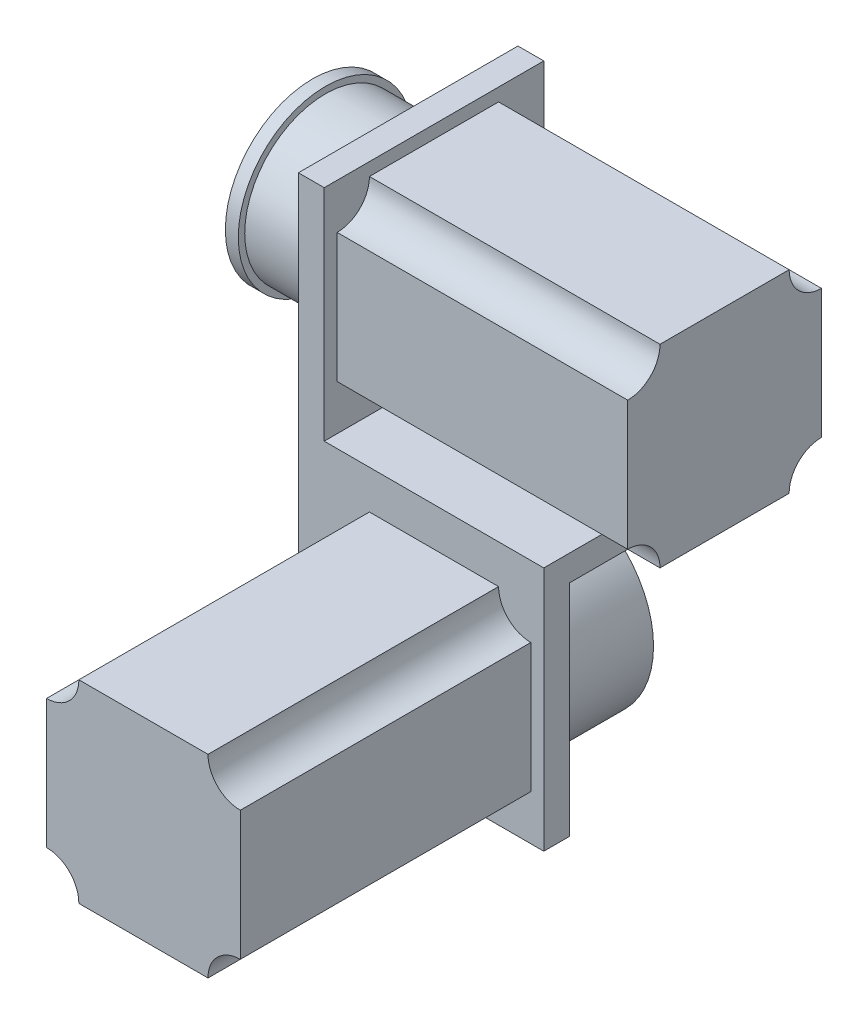
ISO-10303-21;
HEADER;
FILE_DESCRIPTION(('STEP AP214'),'2;1');
FILE_NAME('part.step','',(''),(''),'','','');
FILE_SCHEMA(('AUTOMOTIVE_DESIGN { 1 0 10303 214 1 1 1 1 }'));
ENDSEC;
DATA;
#1=APPLICATION_CONTEXT('core data for automotive mechanical design processes');
#2=APPLICATION_PROTOCOL_DEFINITION('international standard','automotive_design',2000,#1);
#3=PRODUCT_CONTEXT('',#1,'mechanical');
#4=PRODUCT('Part','Part','',(#3));
#5=PRODUCT_RELATED_PRODUCT_CATEGORY('part','',(#4));
#6=PRODUCT_DEFINITION_FORMATION('','',#4);
#7=PRODUCT_DEFINITION_CONTEXT('part definition',#1,'design');
#8=PRODUCT_DEFINITION('design','',#6,#7);
#9=PRODUCT_DEFINITION_SHAPE('','',#8);
#10=(LENGTH_UNIT() NAMED_UNIT(*) SI_UNIT(.MILLI.,.METRE.));
#11=(NAMED_UNIT(*) PLANE_ANGLE_UNIT() SI_UNIT($,.RADIAN.));
#12=(NAMED_UNIT(*) SI_UNIT($,.STERADIAN.) SOLID_ANGLE_UNIT());
#13=UNCERTAINTY_MEASURE_WITH_UNIT(LENGTH_MEASURE(1.E-05),#10,'distance_accuracy_value','');
#14=(GEOMETRIC_REPRESENTATION_CONTEXT(3) GLOBAL_UNCERTAINTY_ASSIGNED_CONTEXT((#13)) GLOBAL_UNIT_ASSIGNED_CONTEXT((#10,
#11,#12)) REPRESENTATION_CONTEXT('',''));
#15=CARTESIAN_POINT('',(0.,0.,0.));
#16=DIRECTION('',(0.,0.,1.));
#17=DIRECTION('',(1.,0.,0.));
#18=AXIS2_PLACEMENT_3D('',#15,#16,#17);
#19=CARTESIAN_POINT('',(-115.398264295538,-54.7615495871551,-85.9384662301803));
#20=DIRECTION('',(1.,0.,0.));
#21=DIRECTION('',(0.,0.,-1.));
#22=AXIS2_PLACEMENT_3D('',#19,#20,#21);
#23=CYLINDRICAL_SURFACE('',#22,62.5);
#24=CARTESIAN_POINT('',(-40.3982642955382,-54.7615495871551,-85.9384662301803));
#25=DIRECTION('',(-1.,0.,0.));
#26=DIRECTION('',(0.,0.,1.));
#27=AXIS2_PLACEMENT_3D('',#24,#25,#26);
#28=CIRCLE('',#27,62.5);
#29=CARTESIAN_POINT('',(-40.3982642955382,-54.7615495871551,-23.4384662301803));
#30=VERTEX_POINT('',#29);
#31=EDGE_CURVE('E313',#30,#30,#28,.T.);
#32=ORIENTED_EDGE('',*,*,#31,.T.);
#33=EDGE_LOOP('',(#32));
#34=FACE_BOUND('',#33,.T.);
#35=CARTESIAN_POINT('',(-105.398264295538,-54.7615495871551,-85.9384662301803));
#36=DIRECTION('',(-1.,0.,0.));
#37=DIRECTION('',(0.,0.,1.));
#38=AXIS2_PLACEMENT_3D('',#35,#36,#37);
#39=CIRCLE('',#38,62.5);
#40=CARTESIAN_POINT('',(-105.398264295538,-54.7615495871551,-23.4384662301803));
#41=VERTEX_POINT('',#40);
#42=EDGE_CURVE('E11',#41,#41,#39,.T.);
#43=ORIENTED_EDGE('',*,*,#42,.F.);
#44=EDGE_LOOP('',(#43));
#45=FACE_BOUND('',#44,.T.);
#46=ADVANCED_FACE('F39',(#34,#45),#23,.T.);
#47=CARTESIAN_POINT('',(-10.3982642955382,-169.761549587155,225.));
#48=DIRECTION('',(1.,0.,0.));
#49=DIRECTION('',(0.,1.,0.));
#50=AXIS2_PLACEMENT_3D('',#47,#48,#49);
#51=PLANE('',#50);
#52=DIRECTION('',(0.,-1.,0.));
#53=VECTOR('',#52,1.);
#54=CARTESIAN_POINT('',(-10.3982642955382,-169.761549587155,0.));
#55=LINE('',#54,#53);
#56=CARTESIAN_POINT('',(-10.3982642955381,-194.761549587155,0.));
#57=VERTEX_POINT('',#56);
#58=CARTESIAN_POINT('',(-10.3982642955381,-294.761549587155,0.));
#59=VERTEX_POINT('',#58);
#60=EDGE_CURVE('E226',#57,#59,#55,.T.);
#61=ORIENTED_EDGE('',*,*,#60,.T.);
#62=DIRECTION('',(0.,0.,1.));
#63=VECTOR('',#62,1.);
#64=CARTESIAN_POINT('',(-10.3982642955381,-294.761549587155,-35.3553390593274));
#65=LINE('',#64,#63);
#66=CARTESIAN_POINT('',(-10.3982642955381,-294.761549587155,225.));
#67=VERTEX_POINT('',#66);
#68=EDGE_CURVE('E826',#59,#67,#65,.T.);
#69=ORIENTED_EDGE('',*,*,#68,.T.);
#70=DIRECTION('',(0.,-1.,0.));
#71=VECTOR('',#70,1.);
#72=CARTESIAN_POINT('',(-10.3982642955382,-169.761549587155,225.));
#73=LINE('',#72,#71);
#74=CARTESIAN_POINT('',(-10.3982642955381,-194.761549587155,225.));
#75=VERTEX_POINT('',#74);
#76=EDGE_CURVE('E223',#75,#67,#73,.T.);
#77=ORIENTED_EDGE('',*,*,#76,.F.);
#78=DIRECTION('',(0.,0.,1.));
#79=VECTOR('',#78,1.);
#80=CARTESIAN_POINT('',(-10.3982642955381,-194.761549587155,-35.3553390593274));
#81=LINE('',#80,#79);
#82=EDGE_CURVE('E798',#57,#75,#81,.T.);
#83=ORIENTED_EDGE('',*,*,#82,.F.);
#84=EDGE_LOOP('',(#61,#69,#77,#83));
#85=FACE_BOUND('',#84,.T.);
#86=ADVANCED_FACE('F417',(#85),#51,.F.);
#87=CARTESIAN_POINT('',(-10.3982642955382,-169.761549587155,225.));
#88=DIRECTION('',(0.,-1.,0.));
#89=DIRECTION('',(0.,0.,-1.));
#90=AXIS2_PLACEMENT_3D('',#87,#88,#89);
#91=PLANE('',#90);
#92=DIRECTION('',(-1.,0.,0.));
#93=VECTOR('',#92,1.);
#94=CARTESIAN_POINT('',(-10.3982642955382,-169.761549587155,225.));
#95=LINE('',#94,#93);
#96=CARTESIAN_POINT('',(114.601735704462,-169.761549587155,225.));
#97=VERTEX_POINT('',#96);
#98=CARTESIAN_POINT('',(14.6017357044618,-169.761549587155,225.));
#99=VERTEX_POINT('',#98);
#100=EDGE_CURVE('E245',#97,#99,#95,.T.);
#101=ORIENTED_EDGE('',*,*,#100,.F.);
#102=DIRECTION('',(0.,0.,1.));
#103=VECTOR('',#102,1.);
#104=CARTESIAN_POINT('',(114.601735704462,-169.761549587155,-35.3553390593274));
#105=LINE('',#104,#103);
#106=CARTESIAN_POINT('',(114.601735704462,-169.761549587155,0.));
#107=VERTEX_POINT('',#106);
#108=EDGE_CURVE('E55',#107,#97,#105,.T.);
#109=ORIENTED_EDGE('',*,*,#108,.F.);
#110=DIRECTION('',(-1.,0.,0.));
#111=VECTOR('',#110,1.);
#112=CARTESIAN_POINT('',(-10.3982642955382,-169.761549587155,0.));
#113=LINE('',#112,#111);
#114=CARTESIAN_POINT('',(14.6017357044618,-169.761549587155,0.));
#115=VERTEX_POINT('',#114);
#116=EDGE_CURVE('E218',#107,#115,#113,.T.);
#117=ORIENTED_EDGE('',*,*,#116,.T.);
#118=DIRECTION('',(0.,0.,1.));
#119=VECTOR('',#118,1.);
#120=CARTESIAN_POINT('',(14.6017357044618,-169.761549587155,-35.3553390593274));
#121=LINE('',#120,#119);
#122=EDGE_CURVE('E784',#115,#99,#121,.T.);
#123=ORIENTED_EDGE('',*,*,#122,.T.);
#124=EDGE_LOOP('',(#101,#109,#117,#123));
#125=FACE_BOUND('',#124,.T.);
#126=ADVANCED_FACE('F423',(#125),#91,.F.);
#127=CARTESIAN_POINT('',(0.,0.,225.));
#128=DIRECTION('',(0.,0.,1.));
#129=DIRECTION('',(1.,0.,0.));
#130=AXIS2_PLACEMENT_3D('',#127,#128,#129);
#131=PLANE('',#130);
#132=CARTESIAN_POINT('',(-10.3982642955381,-319.761549587155,225.));
#133=DIRECTION('',(0.,0.,1.));
#134=DIRECTION('',(1.,0.,0.));
#135=AXIS2_PLACEMENT_3D('',#132,#133,#134);
#136=CIRCLE('',#135,25.);
#137=CARTESIAN_POINT('',(14.6017357044618,-319.761549587155,225.));
#138=VERTEX_POINT('',#137);
#139=EDGE_CURVE('E811',#138,#67,#136,.T.);
#140=ORIENTED_EDGE('',*,*,#139,.F.);
#141=DIRECTION('',(1.,0.,0.));
#142=VECTOR('',#141,1.);
#143=CARTESIAN_POINT('',(-10.3982642955381,-319.761549587155,225.));
#144=LINE('',#143,#142);
#145=CARTESIAN_POINT('',(114.601735704462,-319.761549587155,225.));
#146=VERTEX_POINT('',#145);
#147=EDGE_CURVE('E788',#138,#146,#144,.T.);
#148=ORIENTED_EDGE('',*,*,#147,.T.);
#149=CARTESIAN_POINT('',(139.601735704462,-319.761549587155,225.));
#150=DIRECTION('',(0.,0.,1.));
#151=DIRECTION('',(1.,0.,0.));
#152=AXIS2_PLACEMENT_3D('',#149,#150,#151);
#153=CIRCLE('',#152,25.);
#154=CARTESIAN_POINT('',(139.601735704462,-294.761549587155,225.));
#155=VERTEX_POINT('',#154);
#156=EDGE_CURVE('E810',#155,#146,#153,.T.);
#157=ORIENTED_EDGE('',*,*,#156,.F.);
#158=DIRECTION('',(0.,1.,0.));
#159=VECTOR('',#158,1.);
#160=CARTESIAN_POINT('',(139.601735704462,-169.761549587155,225.));
#161=LINE('',#160,#159);
#162=CARTESIAN_POINT('',(139.601735704462,-194.761549587155,225.));
#163=VERTEX_POINT('',#162);
#164=EDGE_CURVE('E786',#155,#163,#161,.T.);
#165=ORIENTED_EDGE('',*,*,#164,.T.);
#166=CARTESIAN_POINT('',(139.601735704462,-169.761549587155,225.));
#167=DIRECTION('',(0.,0.,1.));
#168=DIRECTION('',(1.,0.,0.));
#169=AXIS2_PLACEMENT_3D('',#166,#167,#168);
#170=CIRCLE('',#169,25.);
#171=EDGE_CURVE('E203',#97,#163,#170,.T.);
#172=ORIENTED_EDGE('',*,*,#171,.F.);
#173=ORIENTED_EDGE('',*,*,#100,.T.);
#174=CARTESIAN_POINT('',(-10.3982642955382,-169.761549587155,225.));
#175=DIRECTION('',(0.,0.,1.));
#176=DIRECTION('',(1.,0.,0.));
#177=AXIS2_PLACEMENT_3D('',#174,#175,#176);
#178=CIRCLE('',#177,25.);
#179=EDGE_CURVE('E792',#99,#75,#178,.F.);
#180=ORIENTED_EDGE('',*,*,#179,.T.);
#181=ORIENTED_EDGE('',*,*,#76,.T.);
#182=EDGE_LOOP('',(#140,#148,#157,#165,#172,#173,#180,#181));
#183=FACE_BOUND('',#182,.T.);
#184=ADVANCED_FACE('F436',(#183),#131,.T.);
#185=CARTESIAN_POINT('',(0.,0.,0.));
#186=DIRECTION('',(0.,0.,-1.));
#187=DIRECTION('',(-1.,0.,0.));
#188=AXIS2_PLACEMENT_3D('',#185,#186,#187);
#189=PLANE('',#188);
#190=ORIENTED_EDGE('',*,*,#60,.F.);
#191=CARTESIAN_POINT('',(-10.3982642955382,-169.761549587155,0.));
#192=DIRECTION('',(0.,0.,-1.));
#193=DIRECTION('',(-1.,0.,0.));
#194=AXIS2_PLACEMENT_3D('',#191,#192,#193);
#195=CIRCLE('',#194,25.);
#196=EDGE_CURVE('E804',#115,#57,#195,.T.);
#197=ORIENTED_EDGE('',*,*,#196,.F.);
#198=ORIENTED_EDGE('',*,*,#116,.F.);
#199=CARTESIAN_POINT('',(139.601735704462,-169.761549587155,0.));
#200=DIRECTION('',(0.,0.,-1.));
#201=DIRECTION('',(-1.,0.,0.));
#202=AXIS2_PLACEMENT_3D('',#199,#200,#201);
#203=CIRCLE('',#202,25.);
#204=CARTESIAN_POINT('',(139.601735704462,-194.761549587155,0.));
#205=VERTEX_POINT('',#204);
#206=EDGE_CURVE('E202',#107,#205,#203,.F.);
#207=ORIENTED_EDGE('',*,*,#206,.T.);
#208=DIRECTION('',(0.,1.,0.));
#209=VECTOR('',#208,1.);
#210=CARTESIAN_POINT('',(139.601735704462,-169.761549587155,0.));
#211=LINE('',#210,#209);
#212=CARTESIAN_POINT('',(139.601735704462,-294.761549587155,0.));
#213=VERTEX_POINT('',#212);
#214=EDGE_CURVE('E216',#213,#205,#211,.T.);
#215=ORIENTED_EDGE('',*,*,#214,.F.);
#216=CARTESIAN_POINT('',(139.601735704462,-319.761549587155,0.));
#217=DIRECTION('',(0.,0.,-1.));
#218=DIRECTION('',(-1.,0.,0.));
#219=AXIS2_PLACEMENT_3D('',#216,#217,#218);
#220=CIRCLE('',#219,25.);
#221=CARTESIAN_POINT('',(114.601735704462,-319.761549587155,0.));
#222=VERTEX_POINT('',#221);
#223=EDGE_CURVE('E816',#213,#222,#220,.F.);
#224=ORIENTED_EDGE('',*,*,#223,.T.);
#225=DIRECTION('',(1.,0.,0.));
#226=VECTOR('',#225,1.);
#227=CARTESIAN_POINT('',(-10.3982642955381,-319.761549587155,0.));
#228=LINE('',#227,#226);
#229=CARTESIAN_POINT('',(14.6017357044618,-319.761549587155,0.));
#230=VERTEX_POINT('',#229);
#231=EDGE_CURVE('E221',#230,#222,#228,.T.);
#232=ORIENTED_EDGE('',*,*,#231,.F.);
#233=CARTESIAN_POINT('',(-10.3982642955381,-319.761549587155,0.));
#234=DIRECTION('',(0.,0.,-1.));
#235=DIRECTION('',(-1.,0.,0.));
#236=AXIS2_PLACEMENT_3D('',#233,#234,#235);
#237=CIRCLE('',#236,25.);
#238=EDGE_CURVE('E823',#230,#59,#237,.F.);
#239=ORIENTED_EDGE('',*,*,#238,.T.);
#240=EDGE_LOOP('',(#190,#197,#198,#207,#215,#224,#232,#239));
#241=FACE_BOUND('',#240,.T.);
#242=DIRECTION('',(0.,-1.,0.));
#243=VECTOR('',#242,1.);
#244=CARTESIAN_POINT('',(-40.3982642955382,-159.761549587155,0.));
#245=LINE('',#244,#243);
#246=CARTESIAN_POINT('',(-40.3982642955382,30.2384504128449,0.));
#247=VERTEX_POINT('',#246);
#248=CARTESIAN_POINT('',(-40.3982642955381,-329.761549587155,0.));
#249=VERTEX_POINT('',#248);
#250=EDGE_CURVE('E302',#247,#249,#245,.T.);
#251=ORIENTED_EDGE('',*,*,#250,.T.);
#252=DIRECTION('',(-1.,0.,0.));
#253=VECTOR('',#252,1.);
#254=CARTESIAN_POINT('',(0.,-329.761549587155,0.));
#255=LINE('',#254,#253);
#256=CARTESIAN_POINT('',(149.601735704462,-329.761549587155,0.));
#257=VERTEX_POINT('',#256);
#258=EDGE_CURVE('E239',#257,#249,#255,.T.);
#259=ORIENTED_EDGE('',*,*,#258,.F.);
#260=DIRECTION('',(0.,1.,0.));
#261=VECTOR('',#260,1.);
#262=CARTESIAN_POINT('',(149.601735704462,-139.761549587155,0.));
#263=LINE('',#262,#261);
#264=CARTESIAN_POINT('',(149.601735704462,-139.761549587155,0.));
#265=VERTEX_POINT('',#264);
#266=EDGE_CURVE('E338',#257,#265,#263,.T.);
#267=ORIENTED_EDGE('',*,*,#266,.T.);
#268=DIRECTION('',(-1.,0.,0.));
#269=VECTOR('',#268,1.);
#270=CARTESIAN_POINT('',(-20.3982642955381,-139.761549587155,0.));
#271=LINE('',#270,#269);
#272=CARTESIAN_POINT('',(-20.3982642955381,-139.761549587155,0.));
#273=VERTEX_POINT('',#272);
#274=EDGE_CURVE('E341',#265,#273,#271,.T.);
#275=ORIENTED_EDGE('',*,*,#274,.T.);
#276=DIRECTION('',(0.,1.,0.));
#277=VECTOR('',#276,1.);
#278=CARTESIAN_POINT('',(-20.3982642955381,30.2384504128449,0.));
#279=LINE('',#278,#277);
#280=CARTESIAN_POINT('',(-20.3982642955381,30.2384504128449,0.));
#281=VERTEX_POINT('',#280);
#282=EDGE_CURVE('E344',#273,#281,#279,.T.);
#283=ORIENTED_EDGE('',*,*,#282,.T.);
#284=DIRECTION('',(-1.,0.,0.));
#285=VECTOR('',#284,1.);
#286=CARTESIAN_POINT('',(-40.3982642955382,30.2384504128449,0.));
#287=LINE('',#286,#285);
#288=EDGE_CURVE('E321',#281,#247,#287,.T.);
#289=ORIENTED_EDGE('',*,*,#288,.T.);
#290=EDGE_LOOP('',(#251,#259,#267,#275,#283,#289));
#291=FACE_BOUND('',#290,.T.);
#292=ADVANCED_FACE('F213',(#241,#291),#189,.F.);
#293=CARTESIAN_POINT('',(204.601735704462,-129.761549587155,-10.));
#294=DIRECTION('',(0.,1.,0.));
#295=DIRECTION('',(-1.,0.,0.));
#296=AXIS2_PLACEMENT_3D('',#293,#294,#295);
#297=PLANE('',#296);
#298=DIRECTION('',(1.,0.,0.));
#299=VECTOR('',#298,1.);
#300=CARTESIAN_POINT('',(-55.7536033548655,-129.761549587155,-135.));
#301=LINE('',#300,#299);
#302=CARTESIAN_POINT('',(-20.3982642955381,-129.761549587155,-135.));
#303=VERTEX_POINT('',#302);
#304=CARTESIAN_POINT('',(204.601735704462,-129.761549587155,-135.));
#305=VERTEX_POINT('',#304);
#306=EDGE_CURVE('E268',#303,#305,#301,.T.);
#307=ORIENTED_EDGE('',*,*,#306,.T.);
#308=DIRECTION('',(0.,0.,-1.));
#309=VECTOR('',#308,1.);
#310=CARTESIAN_POINT('',(204.601735704462,-129.761549587155,-10.));
#311=LINE('',#310,#309);
#312=CARTESIAN_POINT('',(204.601735704462,-129.761549587155,-35.));
#313=VERTEX_POINT('',#312);
#314=EDGE_CURVE('E292',#313,#305,#311,.T.);
#315=ORIENTED_EDGE('',*,*,#314,.F.);
#316=DIRECTION('',(1.,0.,0.));
#317=VECTOR('',#316,1.);
#318=CARTESIAN_POINT('',(-55.7536033548655,-129.761549587155,-35.));
#319=LINE('',#318,#317);
#320=CARTESIAN_POINT('',(-20.3982642955381,-129.761549587155,-35.));
#321=VERTEX_POINT('',#320);
#322=EDGE_CURVE('E254',#321,#313,#319,.T.);
#323=ORIENTED_EDGE('',*,*,#322,.F.);
#324=DIRECTION('',(0.,0.,-1.));
#325=VECTOR('',#324,1.);
#326=CARTESIAN_POINT('',(-20.3982642955381,-129.761549587155,-10.));
#327=LINE('',#326,#325);
#328=EDGE_CURVE('E305',#321,#303,#327,.T.);
#329=ORIENTED_EDGE('',*,*,#328,.T.);
#330=EDGE_LOOP('',(#307,#315,#323,#329));
#331=FACE_BOUND('',#330,.T.);
#332=ADVANCED_FACE('F435',(#331),#297,.F.);
#333=CARTESIAN_POINT('',(204.601735704462,20.2384504128449,-160.));
#334=DIRECTION('',(0.,0.,1.));
#335=DIRECTION('',(1.,0.,0.));
#336=AXIS2_PLACEMENT_3D('',#333,#334,#335);
#337=PLANE('',#336);
#338=DIRECTION('',(0.,1.,0.));
#339=VECTOR('',#338,1.);
#340=CARTESIAN_POINT('',(-20.3982642955381,20.2384504128448,-160.));
#341=LINE('',#340,#339);
#342=CARTESIAN_POINT('',(-20.3982642955381,-104.761549587155,-160.));
#343=VERTEX_POINT('',#342);
#344=CARTESIAN_POINT('',(-20.3982642955381,-4.76154958715517,-160.));
#345=VERTEX_POINT('',#344);
#346=EDGE_CURVE('E308',#343,#345,#341,.T.);
#347=ORIENTED_EDGE('',*,*,#346,.T.);
#348=DIRECTION('',(1.,0.,0.));
#349=VECTOR('',#348,1.);
#350=CARTESIAN_POINT('',(-55.7536033548655,-4.76154958715518,-160.));
#351=LINE('',#350,#349);
#352=CARTESIAN_POINT('',(204.601735704462,-4.76154958715514,-160.));
#353=VERTEX_POINT('',#352);
#354=EDGE_CURVE('E275',#345,#353,#351,.T.);
#355=ORIENTED_EDGE('',*,*,#354,.T.);
#356=DIRECTION('',(0.,1.,0.));
#357=VECTOR('',#356,1.);
#358=CARTESIAN_POINT('',(204.601735704462,20.2384504128449,-160.));
#359=LINE('',#358,#357);
#360=CARTESIAN_POINT('',(204.601735704462,-104.761549587155,-160.));
#361=VERTEX_POINT('',#360);
#362=EDGE_CURVE('E296',#361,#353,#359,.T.);
#363=ORIENTED_EDGE('',*,*,#362,.F.);
#364=DIRECTION('',(1.,0.,0.));
#365=VECTOR('',#364,1.);
#366=CARTESIAN_POINT('',(-55.7536033548655,-104.761549587155,-160.));
#367=LINE('',#366,#365);
#368=EDGE_CURVE('E264',#343,#361,#367,.T.);
#369=ORIENTED_EDGE('',*,*,#368,.F.);
#370=EDGE_LOOP('',(#347,#355,#363,#369));
#371=FACE_BOUND('',#370,.T.);
#372=ADVANCED_FACE('F410',(#371),#337,.F.);
#373=CARTESIAN_POINT('',(204.601735704462,0.,0.));
#374=DIRECTION('',(1.,0.,0.));
#375=DIRECTION('',(0.,1.,0.));
#376=AXIS2_PLACEMENT_3D('',#373,#374,#375);
#377=PLANE('',#376);
#378=CARTESIAN_POINT('',(204.601735704462,20.2384504128449,-160.));
#379=DIRECTION('',(1.,0.,0.));
#380=DIRECTION('',(0.,1.,0.));
#381=AXIS2_PLACEMENT_3D('',#378,#379,#380);
#382=CIRCLE('',#381,25.);
#383=CARTESIAN_POINT('',(204.601735704462,20.2384504128449,-135.));
#384=VERTEX_POINT('',#383);
#385=EDGE_CURVE('E251',#384,#353,#382,.T.);
#386=ORIENTED_EDGE('',*,*,#385,.F.);
#387=DIRECTION('',(0.,0.,1.));
#388=VECTOR('',#387,1.);
#389=CARTESIAN_POINT('',(204.601735704462,20.2384504128449,-10.));
#390=LINE('',#389,#388);
#391=CARTESIAN_POINT('',(204.601735704462,20.2384504128449,-35.));
#392=VERTEX_POINT('',#391);
#393=EDGE_CURVE('E299',#384,#392,#390,.T.);
#394=ORIENTED_EDGE('',*,*,#393,.T.);
#395=CARTESIAN_POINT('',(204.601735704462,20.2384504128449,-10.));
#396=DIRECTION('',(1.,0.,0.));
#397=DIRECTION('',(0.,1.,0.));
#398=AXIS2_PLACEMENT_3D('',#395,#396,#397);
#399=CIRCLE('',#398,25.);
#400=CARTESIAN_POINT('',(204.601735704462,-4.76154958715514,-10.));
#401=VERTEX_POINT('',#400);
#402=EDGE_CURVE('E262',#401,#392,#399,.T.);
#403=ORIENTED_EDGE('',*,*,#402,.F.);
#404=DIRECTION('',(0.,-1.,0.));
#405=VECTOR('',#404,1.);
#406=CARTESIAN_POINT('',(204.601735704462,20.2384504128449,-10.));
#407=LINE('',#406,#405);
#408=CARTESIAN_POINT('',(204.601735704462,-104.761549587155,-10.));
#409=VERTEX_POINT('',#408);
#410=EDGE_CURVE('E289',#401,#409,#407,.T.);
#411=ORIENTED_EDGE('',*,*,#410,.T.);
#412=CARTESIAN_POINT('',(204.601735704462,-129.761549587155,-10.));
#413=DIRECTION('',(1.,0.,0.));
#414=DIRECTION('',(0.,1.,0.));
#415=AXIS2_PLACEMENT_3D('',#412,#413,#414);
#416=CIRCLE('',#415,25.);
#417=EDGE_CURVE('E252',#313,#409,#416,.T.);
#418=ORIENTED_EDGE('',*,*,#417,.F.);
#419=ORIENTED_EDGE('',*,*,#314,.T.);
#420=CARTESIAN_POINT('',(204.601735704462,-129.761549587155,-160.));
#421=DIRECTION('',(1.,0.,0.));
#422=DIRECTION('',(0.,1.,0.));
#423=AXIS2_PLACEMENT_3D('',#420,#421,#422);
#424=CIRCLE('',#423,25.);
#425=EDGE_CURVE('E265',#305,#361,#424,.F.);
#426=ORIENTED_EDGE('',*,*,#425,.T.);
#427=ORIENTED_EDGE('',*,*,#362,.T.);
#428=EDGE_LOOP('',(#386,#394,#403,#411,#418,#419,#426,#427));
#429=FACE_BOUND('',#428,.T.);
#430=ADVANCED_FACE('F402',(#429),#377,.T.);
#431=CARTESIAN_POINT('',(-20.3982642955381,30.2384504128449,-170.));
#432=DIRECTION('',(1.,0.,0.));
#433=DIRECTION('',(0.,1.,0.));
#434=AXIS2_PLACEMENT_3D('',#431,#432,#433);
#435=PLANE('',#434);
#436=CARTESIAN_POINT('',(-20.3982642955381,-129.761549587155,-10.));
#437=DIRECTION('',(1.,0.,0.));
#438=DIRECTION('',(0.,1.,0.));
#439=AXIS2_PLACEMENT_3D('',#436,#437,#438);
#440=CIRCLE('',#439,25.);
#441=CARTESIAN_POINT('',(-20.3982642955381,-104.761549587155,-10.));
#442=VERTEX_POINT('',#441);
#443=EDGE_CURVE('E259',#442,#321,#440,.F.);
#444=ORIENTED_EDGE('',*,*,#443,.F.);
#445=DIRECTION('',(0.,-1.,0.));
#446=VECTOR('',#445,1.);
#447=CARTESIAN_POINT('',(-20.3982642955381,20.2384504128448,-10.));
#448=LINE('',#447,#446);
#449=CARTESIAN_POINT('',(-20.3982642955381,-4.76154958715518,-10.));
#450=VERTEX_POINT('',#449);
#451=EDGE_CURVE('E288',#450,#442,#448,.T.);
#452=ORIENTED_EDGE('',*,*,#451,.F.);
#453=CARTESIAN_POINT('',(-20.3982642955381,20.2384504128448,-10.));
#454=DIRECTION('',(1.,0.,0.));
#455=DIRECTION('',(0.,1.,0.));
#456=AXIS2_PLACEMENT_3D('',#453,#454,#455);
#457=CIRCLE('',#456,25.);
#458=CARTESIAN_POINT('',(-20.3982642955381,20.2384504128448,-35.));
#459=VERTEX_POINT('',#458);
#460=EDGE_CURVE('E285',#459,#450,#457,.F.);
#461=ORIENTED_EDGE('',*,*,#460,.F.);
#462=DIRECTION('',(0.,0.,1.));
#463=VECTOR('',#462,1.);
#464=CARTESIAN_POINT('',(-20.3982642955381,20.2384504128448,-10.));
#465=LINE('',#464,#463);
#466=CARTESIAN_POINT('',(-20.3982642955381,20.2384504128448,-135.));
#467=VERTEX_POINT('',#466);
#468=EDGE_CURVE('E293',#467,#459,#465,.T.);
#469=ORIENTED_EDGE('',*,*,#468,.F.);
#470=CARTESIAN_POINT('',(-20.3982642955381,20.2384504128448,-160.));
#471=DIRECTION('',(1.,0.,0.));
#472=DIRECTION('',(0.,1.,0.));
#473=AXIS2_PLACEMENT_3D('',#470,#471,#472);
#474=CIRCLE('',#473,25.);
#475=EDGE_CURVE('E269',#345,#467,#474,.F.);
#476=ORIENTED_EDGE('',*,*,#475,.F.);
#477=ORIENTED_EDGE('',*,*,#346,.F.);
#478=CARTESIAN_POINT('',(-20.3982642955381,-129.761549587155,-160.));
#479=DIRECTION('',(1.,0.,0.));
#480=DIRECTION('',(0.,1.,0.));
#481=AXIS2_PLACEMENT_3D('',#478,#479,#480);
#482=CIRCLE('',#481,25.);
#483=EDGE_CURVE('E255',#343,#303,#482,.T.);
#484=ORIENTED_EDGE('',*,*,#483,.T.);
#485=ORIENTED_EDGE('',*,*,#328,.F.);
#486=EDGE_LOOP('',(#444,#452,#461,#469,#476,#477,#484,#485));
#487=FACE_BOUND('',#486,.T.);
#488=ORIENTED_EDGE('',*,*,#282,.F.);
#489=DIRECTION('',(0.,0.,1.));
#490=VECTOR('',#489,1.);
#491=CARTESIAN_POINT('',(-20.3982642955381,-139.761549587155,-170.));
#492=LINE('',#491,#490);
#493=CARTESIAN_POINT('',(-20.3982642955381,-139.761549587155,-170.));
#494=VERTEX_POINT('',#493);
#495=EDGE_CURVE('E352',#494,#273,#492,.T.);
#496=ORIENTED_EDGE('',*,*,#495,.F.);
#497=DIRECTION('',(0.,1.,0.));
#498=VECTOR('',#497,1.);
#499=CARTESIAN_POINT('',(-20.3982642955381,30.2384504128449,-170.));
#500=LINE('',#499,#498);
#501=CARTESIAN_POINT('',(-20.3982642955381,30.2384504128449,-170.));
#502=VERTEX_POINT('',#501);
#503=EDGE_CURVE('E330',#494,#502,#500,.T.);
#504=ORIENTED_EDGE('',*,*,#503,.T.);
#505=DIRECTION('',(0.,0.,1.));
#506=VECTOR('',#505,1.);
#507=CARTESIAN_POINT('',(-20.3982642955381,30.2384504128449,-170.));
#508=LINE('',#507,#506);
#509=EDGE_CURVE('E350',#502,#281,#508,.T.);
#510=ORIENTED_EDGE('',*,*,#509,.T.);
#511=EDGE_LOOP('',(#488,#496,#504,#510));
#512=FACE_BOUND('',#511,.T.);
#513=ADVANCED_FACE('F400',(#487,#512),#435,.T.);
#514=CARTESIAN_POINT('',(-40.3982642955382,-159.761549587155,-170.));
#515=DIRECTION('',(-1.,0.,0.));
#516=DIRECTION('',(0.,0.,1.));
#517=AXIS2_PLACEMENT_3D('',#514,#515,#516);
#518=PLANE('',#517);
#519=ORIENTED_EDGE('',*,*,#31,.F.);
#520=EDGE_LOOP('',(#519));
#521=FACE_BOUND('',#520,.T.);
#522=ORIENTED_EDGE('',*,*,#250,.F.);
#523=DIRECTION('',(0.,0.,1.));
#524=VECTOR('',#523,1.);
#525=CARTESIAN_POINT('',(-40.3982642955382,30.2384504128449,-170.));
#526=LINE('',#525,#524);
#527=CARTESIAN_POINT('',(-40.3982642955382,30.2384504128449,-170.));
#528=VERTEX_POINT('',#527);
#529=EDGE_CURVE('E316',#528,#247,#526,.T.);
#530=ORIENTED_EDGE('',*,*,#529,.F.);
#531=DIRECTION('',(0.,-1.,0.));
#532=VECTOR('',#531,1.);
#533=CARTESIAN_POINT('',(-40.3982642955382,-159.761549587155,-170.));
#534=LINE('',#533,#532);
#535=CARTESIAN_POINT('',(-40.3982642955382,-159.761549587155,-170.));
#536=VERTEX_POINT('',#535);
#537=EDGE_CURVE('E317',#528,#536,#534,.T.);
#538=ORIENTED_EDGE('',*,*,#537,.T.);
#539=DIRECTION('',(0.,0.,1.));
#540=VECTOR('',#539,1.);
#541=CARTESIAN_POINT('',(-40.3982642955382,-159.761549587155,-170.));
#542=LINE('',#541,#540);
#543=CARTESIAN_POINT('',(-40.3982642955382,-159.761549587155,-20.));
#544=VERTEX_POINT('',#543);
#545=EDGE_CURVE('E336',#536,#544,#542,.T.);
#546=ORIENTED_EDGE('',*,*,#545,.T.);
#547=DIRECTION('',(0.,1.,0.));
#548=VECTOR('',#547,1.);
#549=CARTESIAN_POINT('',(-40.3982642955381,-329.761549587155,-20.));
#550=LINE('',#549,#548);
#551=CARTESIAN_POINT('',(-40.3982642955381,-329.761549587155,-20.));
#552=VERTEX_POINT('',#551);
#553=EDGE_CURVE('E248',#552,#544,#550,.T.);
#554=ORIENTED_EDGE('',*,*,#553,.F.);
#555=DIRECTION('',(0.,0.,-1.));
#556=VECTOR('',#555,1.);
#557=CARTESIAN_POINT('',(-40.3982642955381,-329.761549587155,0.));
#558=LINE('',#557,#556);
#559=EDGE_CURVE('E230',#249,#552,#558,.T.);
#560=ORIENTED_EDGE('',*,*,#559,.F.);
#561=EDGE_LOOP('',(#522,#530,#538,#546,#554,#560));
#562=FACE_BOUND('',#561,.T.);
#563=ADVANCED_FACE('F41',(#521,#562),#518,.T.);
#564=CARTESIAN_POINT('',(-40.3982642955382,30.2384504128449,-170.));
#565=DIRECTION('',(0.,1.,0.));
#566=DIRECTION('',(0.,0.,1.));
#567=AXIS2_PLACEMENT_3D('',#564,#565,#566);
#568=PLANE('',#567);
#569=ORIENTED_EDGE('',*,*,#288,.F.);
#570=ORIENTED_EDGE('',*,*,#509,.F.);
#571=DIRECTION('',(-1.,0.,0.));
#572=VECTOR('',#571,1.);
#573=CARTESIAN_POINT('',(-40.3982642955382,30.2384504128449,-170.));
#574=LINE('',#573,#572);
#575=EDGE_CURVE('E333',#502,#528,#574,.T.);
#576=ORIENTED_EDGE('',*,*,#575,.T.);
#577=ORIENTED_EDGE('',*,*,#529,.T.);
#578=EDGE_LOOP('',(#569,#570,#576,#577));
#579=FACE_BOUND('',#578,.T.);
#580=ADVANCED_FACE('F399',(#579),#568,.T.);
#581=CARTESIAN_POINT('',(-20.3982642955381,-139.761549587155,-170.));
#582=DIRECTION('',(0.,1.,0.));
#583=DIRECTION('',(0.,0.,1.));
#584=AXIS2_PLACEMENT_3D('',#581,#582,#583);
#585=PLANE('',#584);
#586=ORIENTED_EDGE('',*,*,#274,.F.);
#587=DIRECTION('',(0.,0.,1.));
#588=VECTOR('',#587,1.);
#589=CARTESIAN_POINT('',(149.601735704462,-139.761549587155,-170.));
#590=LINE('',#589,#588);
#591=CARTESIAN_POINT('',(149.601735704462,-139.761549587155,-170.));
#592=VERTEX_POINT('',#591);
#593=EDGE_CURVE('E354',#592,#265,#590,.T.);
#594=ORIENTED_EDGE('',*,*,#593,.F.);
#595=DIRECTION('',(-1.,0.,0.));
#596=VECTOR('',#595,1.);
#597=CARTESIAN_POINT('',(-20.3982642955381,-139.761549587155,-170.));
#598=LINE('',#597,#596);
#599=EDGE_CURVE('E327',#592,#494,#598,.T.);
#600=ORIENTED_EDGE('',*,*,#599,.T.);
#601=ORIENTED_EDGE('',*,*,#495,.T.);
#602=EDGE_LOOP('',(#586,#594,#600,#601));
#603=FACE_BOUND('',#602,.T.);
#604=ADVANCED_FACE('F395',(#603),#585,.T.);
#605=CARTESIAN_POINT('',(149.601735704462,-139.761549587155,-170.));
#606=DIRECTION('',(1.,0.,0.));
#607=DIRECTION('',(0.,0.,-1.));
#608=AXIS2_PLACEMENT_3D('',#605,#606,#607);
#609=PLANE('',#608);
#610=ORIENTED_EDGE('',*,*,#266,.F.);
#611=DIRECTION('',(0.,0.,1.));
#612=VECTOR('',#611,1.);
#613=CARTESIAN_POINT('',(149.601735704462,-329.761549587155,0.));
#614=LINE('',#613,#612);
#615=CARTESIAN_POINT('',(149.601735704462,-329.761549587155,-20.));
#616=VERTEX_POINT('',#615);
#617=EDGE_CURVE('E236',#616,#257,#614,.T.);
#618=ORIENTED_EDGE('',*,*,#617,.F.);
#619=DIRECTION('',(0.,1.,0.));
#620=VECTOR('',#619,1.);
#621=CARTESIAN_POINT('',(149.601735704462,-329.761549587155,-20.));
#622=LINE('',#621,#620);
#623=CARTESIAN_POINT('',(149.601735704462,-159.761549587155,-20.));
#624=VERTEX_POINT('',#623);
#625=EDGE_CURVE('E242',#616,#624,#622,.T.);
#626=ORIENTED_EDGE('',*,*,#625,.T.);
#627=DIRECTION('',(0.,0.,1.));
#628=VECTOR('',#627,1.);
#629=CARTESIAN_POINT('',(149.601735704462,-159.761549587155,-170.));
#630=LINE('',#629,#628);
#631=CARTESIAN_POINT('',(149.601735704462,-159.761549587155,-170.));
#632=VERTEX_POINT('',#631);
#633=EDGE_CURVE('E356',#632,#624,#630,.T.);
#634=ORIENTED_EDGE('',*,*,#633,.F.);
#635=DIRECTION('',(0.,1.,0.));
#636=VECTOR('',#635,1.);
#637=CARTESIAN_POINT('',(149.601735704462,-139.761549587155,-170.));
#638=LINE('',#637,#636);
#639=EDGE_CURVE('E324',#632,#592,#638,.T.);
#640=ORIENTED_EDGE('',*,*,#639,.T.);
#641=ORIENTED_EDGE('',*,*,#593,.T.);
#642=EDGE_LOOP('',(#610,#618,#626,#634,#640,#641));
#643=FACE_BOUND('',#642,.T.);
#644=ADVANCED_FACE('F377',(#643),#609,.T.);
#645=CARTESIAN_POINT('',(149.601735704462,-159.761549587155,-170.));
#646=DIRECTION('',(0.,-1.,0.));
#647=DIRECTION('',(1.,0.,0.));
#648=AXIS2_PLACEMENT_3D('',#645,#646,#647);
#649=PLANE('',#648);
#650=DIRECTION('',(1.,0.,0.));
#651=VECTOR('',#650,1.);
#652=CARTESIAN_POINT('',(0.,-159.761549587155,-20.));
#653=LINE('',#652,#651);
#654=EDGE_CURVE('E234',#544,#624,#653,.T.);
#655=ORIENTED_EDGE('',*,*,#654,.F.);
#656=ORIENTED_EDGE('',*,*,#545,.F.);
#657=DIRECTION('',(1.,0.,0.));
#658=VECTOR('',#657,1.);
#659=CARTESIAN_POINT('',(149.601735704462,-159.761549587155,-170.));
#660=LINE('',#659,#658);
#661=EDGE_CURVE('E320',#536,#632,#660,.T.);
#662=ORIENTED_EDGE('',*,*,#661,.T.);
#663=ORIENTED_EDGE('',*,*,#633,.T.);
#664=EDGE_LOOP('',(#655,#656,#662,#663));
#665=FACE_BOUND('',#664,.T.);
#666=ADVANCED_FACE('F387',(#665),#649,.T.);
#667=CARTESIAN_POINT('',(0.,0.,-170.));
#668=DIRECTION('',(0.,0.,-1.));
#669=DIRECTION('',(-1.,0.,0.));
#670=AXIS2_PLACEMENT_3D('',#667,#668,#669);
#671=PLANE('',#670);
#672=ORIENTED_EDGE('',*,*,#537,.F.);
#673=ORIENTED_EDGE('',*,*,#575,.F.);
#674=ORIENTED_EDGE('',*,*,#503,.F.);
#675=ORIENTED_EDGE('',*,*,#599,.F.);
#676=ORIENTED_EDGE('',*,*,#639,.F.);
#677=ORIENTED_EDGE('',*,*,#661,.F.);
#678=EDGE_LOOP('',(#672,#673,#674,#675,#676,#677));
#679=FACE_BOUND('',#678,.T.);
#680=ADVANCED_FACE('F389',(#679),#671,.T.);
#681=CARTESIAN_POINT('',(204.601735704462,20.2384504128449,-10.));
#682=DIRECTION('',(0.,0.,-1.));
#683=DIRECTION('',(0.,1.,0.));
#684=AXIS2_PLACEMENT_3D('',#681,#682,#683);
#685=PLANE('',#684);
#686=ORIENTED_EDGE('',*,*,#451,.T.);
#687=DIRECTION('',(1.,0.,0.));
#688=VECTOR('',#687,1.);
#689=CARTESIAN_POINT('',(-55.7536033548655,-104.761549587155,-10.));
#690=LINE('',#689,#688);
#691=EDGE_CURVE('E256',#442,#409,#690,.T.);
#692=ORIENTED_EDGE('',*,*,#691,.T.);
#693=ORIENTED_EDGE('',*,*,#410,.F.);
#694=DIRECTION('',(1.,0.,0.));
#695=VECTOR('',#694,1.);
#696=CARTESIAN_POINT('',(-55.7536033548655,-4.76154958715518,-10.));
#697=LINE('',#696,#695);
#698=EDGE_CURVE('E281',#450,#401,#697,.T.);
#699=ORIENTED_EDGE('',*,*,#698,.F.);
#700=EDGE_LOOP('',(#686,#692,#693,#699));
#701=FACE_BOUND('',#700,.T.);
#702=ADVANCED_FACE('F433',(#701),#685,.F.);
#703=CARTESIAN_POINT('',(204.601735704462,20.2384504128449,-10.));
#704=DIRECTION('',(0.,-1.,0.));
#705=DIRECTION('',(1.,0.,0.));
#706=AXIS2_PLACEMENT_3D('',#703,#704,#705);
#707=PLANE('',#706);
#708=ORIENTED_EDGE('',*,*,#393,.F.);
#709=DIRECTION('',(1.,0.,0.));
#710=VECTOR('',#709,1.);
#711=CARTESIAN_POINT('',(-55.7536033548655,20.2384504128448,-135.));
#712=LINE('',#711,#710);
#713=EDGE_CURVE('E274',#467,#384,#712,.T.);
#714=ORIENTED_EDGE('',*,*,#713,.F.);
#715=ORIENTED_EDGE('',*,*,#468,.T.);
#716=DIRECTION('',(1.,0.,0.));
#717=VECTOR('',#716,1.);
#718=CARTESIAN_POINT('',(-55.7536033548655,20.2384504128448,-35.));
#719=LINE('',#718,#717);
#720=EDGE_CURVE('E282',#459,#392,#719,.T.);
#721=ORIENTED_EDGE('',*,*,#720,.T.);
#722=EDGE_LOOP('',(#708,#714,#715,#721));
#723=FACE_BOUND('',#722,.T.);
#724=ADVANCED_FACE('F462',(#723),#707,.F.);
#725=CARTESIAN_POINT('',(-55.7536033548655,20.2384504128448,-10.));
#726=DIRECTION('',(1.,0.,0.));
#727=DIRECTION('',(0.,1.,0.));
#728=AXIS2_PLACEMENT_3D('',#725,#726,#727);
#729=CYLINDRICAL_SURFACE('',#728,25.);
#730=ORIENTED_EDGE('',*,*,#460,.T.);
#731=ORIENTED_EDGE('',*,*,#698,.T.);
#732=ORIENTED_EDGE('',*,*,#402,.T.);
#733=ORIENTED_EDGE('',*,*,#720,.F.);
#734=EDGE_LOOP('',(#730,#731,#732,#733));
#735=FACE_BOUND('',#734,.T.);
#736=ADVANCED_FACE('F469',(#735),#729,.F.);
#737=CARTESIAN_POINT('',(-55.7536033548655,-129.761549587155,-10.));
#738=DIRECTION('',(1.,0.,0.));
#739=DIRECTION('',(0.,1.,0.));
#740=AXIS2_PLACEMENT_3D('',#737,#738,#739);
#741=CYLINDRICAL_SURFACE('',#740,25.);
#742=ORIENTED_EDGE('',*,*,#443,.T.);
#743=ORIENTED_EDGE('',*,*,#322,.T.);
#744=ORIENTED_EDGE('',*,*,#417,.T.);
#745=ORIENTED_EDGE('',*,*,#691,.F.);
#746=EDGE_LOOP('',(#742,#743,#744,#745));
#747=FACE_BOUND('',#746,.T.);
#748=ADVANCED_FACE('F477',(#747),#741,.F.);
#749=CARTESIAN_POINT('',(-55.7536033548655,-129.761549587155,-160.));
#750=DIRECTION('',(1.,0.,0.));
#751=DIRECTION('',(0.,1.,0.));
#752=AXIS2_PLACEMENT_3D('',#749,#750,#751);
#753=CYLINDRICAL_SURFACE('',#752,25.);
#754=ORIENTED_EDGE('',*,*,#368,.T.);
#755=ORIENTED_EDGE('',*,*,#425,.F.);
#756=ORIENTED_EDGE('',*,*,#306,.F.);
#757=ORIENTED_EDGE('',*,*,#483,.F.);
#758=EDGE_LOOP('',(#754,#755,#756,#757));
#759=FACE_BOUND('',#758,.T.);
#760=ADVANCED_FACE('F485',(#759),#753,.F.);
#761=CARTESIAN_POINT('',(-55.7536033548655,20.2384504128448,-160.));
#762=DIRECTION('',(1.,0.,0.));
#763=DIRECTION('',(0.,1.,0.));
#764=AXIS2_PLACEMENT_3D('',#761,#762,#763);
#765=CYLINDRICAL_SURFACE('',#764,25.);
#766=ORIENTED_EDGE('',*,*,#475,.T.);
#767=ORIENTED_EDGE('',*,*,#713,.T.);
#768=ORIENTED_EDGE('',*,*,#385,.T.);
#769=ORIENTED_EDGE('',*,*,#354,.F.);
#770=EDGE_LOOP('',(#766,#767,#768,#769));
#771=FACE_BOUND('',#770,.T.);
#772=ADVANCED_FACE('F369',(#771),#765,.F.);
#773=CARTESIAN_POINT('',(0.,-329.761549587155,-20.));
#774=DIRECTION('',(0.,0.,1.));
#775=DIRECTION('',(1.,0.,0.));
#776=AXIS2_PLACEMENT_3D('',#773,#774,#775);
#777=PLANE('',#776);
#778=CARTESIAN_POINT('',(64.6017357044619,-244.761549587155,-20.));
#779=DIRECTION('',(0.,0.,1.));
#780=DIRECTION('',(1.,0.,0.));
#781=AXIS2_PLACEMENT_3D('',#778,#779,#780);
#782=CIRCLE('',#781,75.);
#783=CARTESIAN_POINT('',(139.601735704462,-244.761549587155,-20.));
#784=VERTEX_POINT('',#783);
#785=EDGE_CURVE('E48',#784,#784,#782,.F.);
#786=ORIENTED_EDGE('',*,*,#785,.F.);
#787=EDGE_LOOP('',(#786));
#788=FACE_BOUND('',#787,.T.);
#789=ORIENTED_EDGE('',*,*,#654,.T.);
#790=ORIENTED_EDGE('',*,*,#625,.F.);
#791=DIRECTION('',(1.,0.,0.));
#792=VECTOR('',#791,1.);
#793=CARTESIAN_POINT('',(0.,-329.761549587155,-20.));
#794=LINE('',#793,#792);
#795=EDGE_CURVE('E233',#552,#616,#794,.T.);
#796=ORIENTED_EDGE('',*,*,#795,.F.);
#797=ORIENTED_EDGE('',*,*,#553,.T.);
#798=EDGE_LOOP('',(#789,#790,#796,#797));
#799=FACE_BOUND('',#798,.T.);
#800=ADVANCED_FACE('F365',(#788,#799),#777,.F.);
#801=CARTESIAN_POINT('',(0.,-329.761549587155,0.));
#802=DIRECTION('',(0.,-1.,0.));
#803=DIRECTION('',(1.,0.,0.));
#804=AXIS2_PLACEMENT_3D('',#801,#802,#803);
#805=PLANE('',#804);
#806=ORIENTED_EDGE('',*,*,#559,.T.);
#807=ORIENTED_EDGE('',*,*,#795,.T.);
#808=ORIENTED_EDGE('',*,*,#617,.T.);
#809=ORIENTED_EDGE('',*,*,#258,.T.);
#810=EDGE_LOOP('',(#806,#807,#808,#809));
#811=FACE_BOUND('',#810,.T.);
#812=ADVANCED_FACE('F368',(#811),#805,.T.);
#813=CARTESIAN_POINT('',(-10.3982642955381,-319.761549587155,225.));
#814=DIRECTION('',(0.,1.,0.));
#815=DIRECTION('',(0.,0.,1.));
#816=AXIS2_PLACEMENT_3D('',#813,#814,#815);
#817=PLANE('',#816);
#818=ORIENTED_EDGE('',*,*,#147,.F.);
#819=DIRECTION('',(0.,0.,1.));
#820=VECTOR('',#819,1.);
#821=CARTESIAN_POINT('',(14.6017357044618,-319.761549587155,-35.3553390593274));
#822=LINE('',#821,#820);
#823=EDGE_CURVE('E802',#230,#138,#822,.T.);
#824=ORIENTED_EDGE('',*,*,#823,.F.);
#825=ORIENTED_EDGE('',*,*,#231,.T.);
#826=DIRECTION('',(0.,0.,1.));
#827=VECTOR('',#826,1.);
#828=CARTESIAN_POINT('',(114.601735704462,-319.761549587155,-35.3553390593274));
#829=LINE('',#828,#827);
#830=EDGE_CURVE('E815',#222,#146,#829,.T.);
#831=ORIENTED_EDGE('',*,*,#830,.T.);
#832=EDGE_LOOP('',(#818,#824,#825,#831));
#833=FACE_BOUND('',#832,.T.);
#834=ADVANCED_FACE('F513',(#833),#817,.F.);
#835=CARTESIAN_POINT('',(139.601735704462,-169.761549587155,225.));
#836=DIRECTION('',(-1.,0.,0.));
#837=DIRECTION('',(0.,0.,1.));
#838=AXIS2_PLACEMENT_3D('',#835,#836,#837);
#839=PLANE('',#838);
#840=ORIENTED_EDGE('',*,*,#164,.F.);
#841=DIRECTION('',(0.,0.,1.));
#842=VECTOR('',#841,1.);
#843=CARTESIAN_POINT('',(139.601735704462,-294.761549587155,-35.3553390593274));
#844=LINE('',#843,#842);
#845=EDGE_CURVE('E63',#213,#155,#844,.T.);
#846=ORIENTED_EDGE('',*,*,#845,.F.);
#847=ORIENTED_EDGE('',*,*,#214,.T.);
#848=DIRECTION('',(0.,0.,1.));
#849=VECTOR('',#848,1.);
#850=CARTESIAN_POINT('',(139.601735704462,-194.761549587155,-35.3553390593274));
#851=LINE('',#850,#849);
#852=EDGE_CURVE('E199',#205,#163,#851,.T.);
#853=ORIENTED_EDGE('',*,*,#852,.T.);
#854=EDGE_LOOP('',(#840,#846,#847,#853));
#855=FACE_BOUND('',#854,.T.);
#856=ADVANCED_FACE('F220',(#855),#839,.F.);
#857=CARTESIAN_POINT('',(-10.3982642955382,-169.761549587155,-35.3553390593274));
#858=DIRECTION('',(0.,0.,1.));
#859=DIRECTION('',(1.,0.,0.));
#860=AXIS2_PLACEMENT_3D('',#857,#858,#859);
#861=CYLINDRICAL_SURFACE('',#860,25.);
#862=ORIENTED_EDGE('',*,*,#196,.T.);
#863=ORIENTED_EDGE('',*,*,#82,.T.);
#864=ORIENTED_EDGE('',*,*,#179,.F.);
#865=ORIENTED_EDGE('',*,*,#122,.F.);
#866=EDGE_LOOP('',(#862,#863,#864,#865));
#867=FACE_BOUND('',#866,.T.);
#868=ADVANCED_FACE('F529',(#867),#861,.F.);
#869=CARTESIAN_POINT('',(139.601735704462,-169.761549587155,-35.3553390593274));
#870=DIRECTION('',(0.,0.,1.));
#871=DIRECTION('',(1.,0.,0.));
#872=AXIS2_PLACEMENT_3D('',#869,#870,#871);
#873=CYLINDRICAL_SURFACE('',#872,25.);
#874=ORIENTED_EDGE('',*,*,#108,.T.);
#875=ORIENTED_EDGE('',*,*,#171,.T.);
#876=ORIENTED_EDGE('',*,*,#852,.F.);
#877=ORIENTED_EDGE('',*,*,#206,.F.);
#878=EDGE_LOOP('',(#874,#875,#876,#877));
#879=FACE_BOUND('',#878,.T.);
#880=ADVANCED_FACE('F201',(#879),#873,.F.);
#881=CARTESIAN_POINT('',(139.601735704462,-319.761549587155,-35.3553390593274));
#882=DIRECTION('',(0.,0.,1.));
#883=DIRECTION('',(1.,0.,0.));
#884=AXIS2_PLACEMENT_3D('',#881,#882,#883);
#885=CYLINDRICAL_SURFACE('',#884,25.);
#886=ORIENTED_EDGE('',*,*,#845,.T.);
#887=ORIENTED_EDGE('',*,*,#156,.T.);
#888=ORIENTED_EDGE('',*,*,#830,.F.);
#889=ORIENTED_EDGE('',*,*,#223,.F.);
#890=EDGE_LOOP('',(#886,#887,#888,#889));
#891=FACE_BOUND('',#890,.T.);
#892=ADVANCED_FACE('F543',(#891),#885,.F.);
#893=CARTESIAN_POINT('',(-10.3982642955381,-319.761549587155,-35.3553390593274));
#894=DIRECTION('',(0.,0.,1.));
#895=DIRECTION('',(1.,0.,0.));
#896=AXIS2_PLACEMENT_3D('',#893,#894,#895);
#897=CYLINDRICAL_SURFACE('',#896,25.);
#898=ORIENTED_EDGE('',*,*,#823,.T.);
#899=ORIENTED_EDGE('',*,*,#139,.T.);
#900=ORIENTED_EDGE('',*,*,#68,.F.);
#901=ORIENTED_EDGE('',*,*,#238,.F.);
#902=EDGE_LOOP('',(#898,#899,#900,#901));
#903=FACE_BOUND('',#902,.T.);
#904=ADVANCED_FACE('F550',(#903),#897,.F.);
#905=CARTESIAN_POINT('',(64.6017357044619,-244.761549587155,-95.));
#906=DIRECTION('',(0.,0.,-1.));
#907=DIRECTION('',(-1.,0.,0.));
#908=AXIS2_PLACEMENT_3D('',#905,#906,#907);
#909=PLANE('',#908);
#910=CARTESIAN_POINT('',(64.6017357044619,-244.761549587155,-95.));
#911=DIRECTION('',(0.,0.,-1.));
#912=DIRECTION('',(-1.,0.,0.));
#913=AXIS2_PLACEMENT_3D('',#910,#911,#912);
#914=CIRCLE('',#913,75.);
#915=CARTESIAN_POINT('',(-10.3982642955381,-244.761549587155,-95.));
#916=VERTEX_POINT('',#915);
#917=EDGE_CURVE('E824',#916,#916,#914,.T.);
#918=ORIENTED_EDGE('',*,*,#917,.T.);
#919=EDGE_LOOP('',(#918));
#920=FACE_BOUND('',#919,.T.);
#921=CARTESIAN_POINT('',(64.6017357044619,-244.761549587155,-95.));
#922=DIRECTION('',(0.,0.,-1.));
#923=DIRECTION('',(-1.,0.,0.));
#924=AXIS2_PLACEMENT_3D('',#921,#922,#923);
#925=CIRCLE('',#924,62.5);
#926=CARTESIAN_POINT('',(2.10173570446191,-244.761549587155,-95.));
#927=VERTEX_POINT('',#926);
#928=EDGE_CURVE('E832',#927,#927,#925,.T.);
#929=ORIENTED_EDGE('',*,*,#928,.F.);
#930=EDGE_LOOP('',(#929));
#931=FACE_BOUND('',#930,.T.);
#932=ADVANCED_FACE('F556',(#920,#931),#909,.T.);
#933=CARTESIAN_POINT('',(64.6017357044619,-244.761549587155,-95.));
#934=DIRECTION('',(0.,0.,1.));
#935=DIRECTION('',(1.,0.,0.));
#936=AXIS2_PLACEMENT_3D('',#933,#934,#935);
#937=CYLINDRICAL_SURFACE('',#936,75.);
#938=ORIENTED_EDGE('',*,*,#917,.F.);
#939=EDGE_LOOP('',(#938));
#940=FACE_BOUND('',#939,.T.);
#941=ORIENTED_EDGE('',*,*,#785,.T.);
#942=EDGE_LOOP('',(#941));
#943=FACE_BOUND('',#942,.T.);
#944=ADVANCED_FACE('F363',(#940,#943),#937,.T.);
#945=CARTESIAN_POINT('',(64.6017357044619,-244.761549587155,-95.));
#946=DIRECTION('',(0.,0.,1.));
#947=DIRECTION('',(1.,0.,0.));
#948=AXIS2_PLACEMENT_3D('',#945,#946,#947);
#949=CYLINDRICAL_SURFACE('',#948,62.5);
#950=CARTESIAN_POINT('',(64.6017357044619,-244.761549587155,-30.));
#951=DIRECTION('',(0.,0.,-1.));
#952=DIRECTION('',(-1.,0.,0.));
#953=AXIS2_PLACEMENT_3D('',#950,#951,#952);
#954=CIRCLE('',#953,62.5);
#955=CARTESIAN_POINT('',(2.10173570446191,-244.761549587155,-30.));
#956=VERTEX_POINT('',#955);
#957=EDGE_CURVE('E43',#956,#956,#954,.T.);
#958=ORIENTED_EDGE('',*,*,#957,.F.);
#959=EDGE_LOOP('',(#958));
#960=FACE_BOUND('',#959,.T.);
#961=ORIENTED_EDGE('',*,*,#928,.T.);
#962=EDGE_LOOP('',(#961));
#963=FACE_BOUND('',#962,.T.);
#964=ADVANCED_FACE('F570',(#960,#963),#949,.F.);
#965=CARTESIAN_POINT('',(-105.398264295538,-54.7615495871551,-85.9384662301803));
#966=DIRECTION('',(-1.,0.,0.));
#967=DIRECTION('',(0.,0.,1.));
#968=AXIS2_PLACEMENT_3D('',#965,#966,#967);
#969=CYLINDRICAL_SURFACE('',#968,67.5);
#970=CARTESIAN_POINT('',(-105.398264295538,-54.7615495871551,-85.9384662301803));
#971=DIRECTION('',(-1.,0.,0.));
#972=DIRECTION('',(0.,0.,1.));
#973=AXIS2_PLACEMENT_3D('',#970,#971,#972);
#974=CIRCLE('',#973,67.5);
#975=CARTESIAN_POINT('',(-105.398264295538,-54.7615495871551,-18.4384662301803));
#976=VERTEX_POINT('',#975);
#977=EDGE_CURVE('E835',#976,#976,#974,.T.);
#978=ORIENTED_EDGE('',*,*,#977,.T.);
#979=EDGE_LOOP('',(#978));
#980=FACE_BOUND('',#979,.T.);
#981=CARTESIAN_POINT('',(-115.398264295538,-54.7615495871551,-85.9384662301803));
#982=DIRECTION('',(-1.,0.,0.));
#983=DIRECTION('',(0.,0.,1.));
#984=AXIS2_PLACEMENT_3D('',#981,#982,#983);
#985=CIRCLE('',#984,67.5);
#986=CARTESIAN_POINT('',(-115.398264295538,-54.7615495871551,-18.4384662301803));
#987=VERTEX_POINT('',#986);
#988=EDGE_CURVE('E836',#987,#987,#985,.T.);
#989=ORIENTED_EDGE('',*,*,#988,.F.);
#990=EDGE_LOOP('',(#989));
#991=FACE_BOUND('',#990,.T.);
#992=ADVANCED_FACE('F578',(#980,#991),#969,.T.);
#993=CARTESIAN_POINT('',(-105.398264295538,-54.7615495871551,-85.9384662301803));
#994=DIRECTION('',(-1.,0.,0.));
#995=DIRECTION('',(0.,0.,1.));
#996=AXIS2_PLACEMENT_3D('',#993,#994,#995);
#997=PLANE('',#996);
#998=ORIENTED_EDGE('',*,*,#42,.T.);
#999=EDGE_LOOP('',(#998));
#1000=FACE_BOUND('',#999,.T.);
#1001=ORIENTED_EDGE('',*,*,#977,.F.);
#1002=EDGE_LOOP('',(#1001));
#1003=FACE_BOUND('',#1002,.T.);
#1004=ADVANCED_FACE('F588',(#1000,#1003),#997,.F.);
#1005=CARTESIAN_POINT('',(-115.398264295538,-54.7615495871551,-85.9384662301803));
#1006=DIRECTION('',(-1.,0.,0.));
#1007=DIRECTION('',(0.,0.,1.));
#1008=AXIS2_PLACEMENT_3D('',#1005,#1006,#1007);
#1009=PLANE('',#1008);
#1010=ORIENTED_EDGE('',*,*,#988,.T.);
#1011=EDGE_LOOP('',(#1010));
#1012=FACE_BOUND('',#1011,.T.);
#1013=ADVANCED_FACE('F429',(#1012),#1009,.T.);
#1014=CARTESIAN_POINT('',(64.6017357044619,-177.261549587155,-30.));
#1015=DIRECTION('',(0.,0.,-1.));
#1016=DIRECTION('',(-1.,0.,0.));
#1017=AXIS2_PLACEMENT_3D('',#1014,#1015,#1016);
#1018=PLANE('',#1017);
#1019=ORIENTED_EDGE('',*,*,#957,.T.);
#1020=EDGE_LOOP('',(#1019));
#1021=FACE_BOUND('',#1020,.T.);
#1022=CARTESIAN_POINT('',(64.6017357044619,-244.761549587155,-30.));
#1023=DIRECTION('',(0.,0.,-1.));
#1024=DIRECTION('',(-1.,0.,0.));
#1025=AXIS2_PLACEMENT_3D('',#1022,#1023,#1024);
#1026=CIRCLE('',#1025,67.5);
#1027=CARTESIAN_POINT('',(-2.89826429553809,-244.761549587155,-30.));
#1028=VERTEX_POINT('',#1027);
#1029=EDGE_CURVE('E844',#1028,#1028,#1026,.T.);
#1030=ORIENTED_EDGE('',*,*,#1029,.F.);
#1031=EDGE_LOOP('',(#1030));
#1032=FACE_BOUND('',#1031,.T.);
#1033=ADVANCED_FACE('F602',(#1021,#1032),#1018,.F.);
#1034=CARTESIAN_POINT('',(64.6017357044619,-244.761549587155,-95.));
#1035=DIRECTION('',(0.,0.,-1.));
#1036=DIRECTION('',(-1.,0.,0.));
#1037=AXIS2_PLACEMENT_3D('',#1034,#1035,#1036);
#1038=CYLINDRICAL_SURFACE('',#1037,67.5);
#1039=CARTESIAN_POINT('',(64.6017357044619,-244.761549587155,-20.));
#1040=DIRECTION('',(0.,0.,-1.));
#1041=DIRECTION('',(-1.,0.,0.));
#1042=AXIS2_PLACEMENT_3D('',#1039,#1040,#1041);
#1043=CIRCLE('',#1042,67.5);
#1044=CARTESIAN_POINT('',(-2.89826429553809,-244.761549587155,-20.));
#1045=VERTEX_POINT('',#1044);
#1046=EDGE_CURVE('E841',#1045,#1045,#1043,.T.);
#1047=ORIENTED_EDGE('',*,*,#1046,.F.);
#1048=EDGE_LOOP('',(#1047));
#1049=FACE_BOUND('',#1048,.T.);
#1050=ORIENTED_EDGE('',*,*,#1029,.T.);
#1051=EDGE_LOOP('',(#1050));
#1052=FACE_BOUND('',#1051,.T.);
#1053=ADVANCED_FACE('F608',(#1049,#1052),#1038,.F.);
#1054=ORIENTED_EDGE('',*,*,#1046,.T.);
#1055=EDGE_LOOP('',(#1054));
#1056=FACE_BOUND('',#1055,.T.);
#1057=ADVANCED_FACE('F371',(#1056),#777,.F.);
#1058=CLOSED_SHELL('',(#46,#86,#126,#184,#292,#332,#372,#430,#513,#563,#580,#604,#644,#666,#680,
#702,#724,#736,#748,#760,#772,#800,#812,#834,#856,#868,#880,#892,#904,#932,#944,#964,#992,#1004,
#1013,#1033,#1053,#1057));
#1059=MANIFOLD_SOLID_BREP('B2',#1058);
#1060=ADVANCED_BREP_SHAPE_REPRESENTATION('',(#18,#1059),#14);
#1061=SHAPE_DEFINITION_REPRESENTATION(#9,#1060);
ENDSEC;
END-ISO-10303-21;
